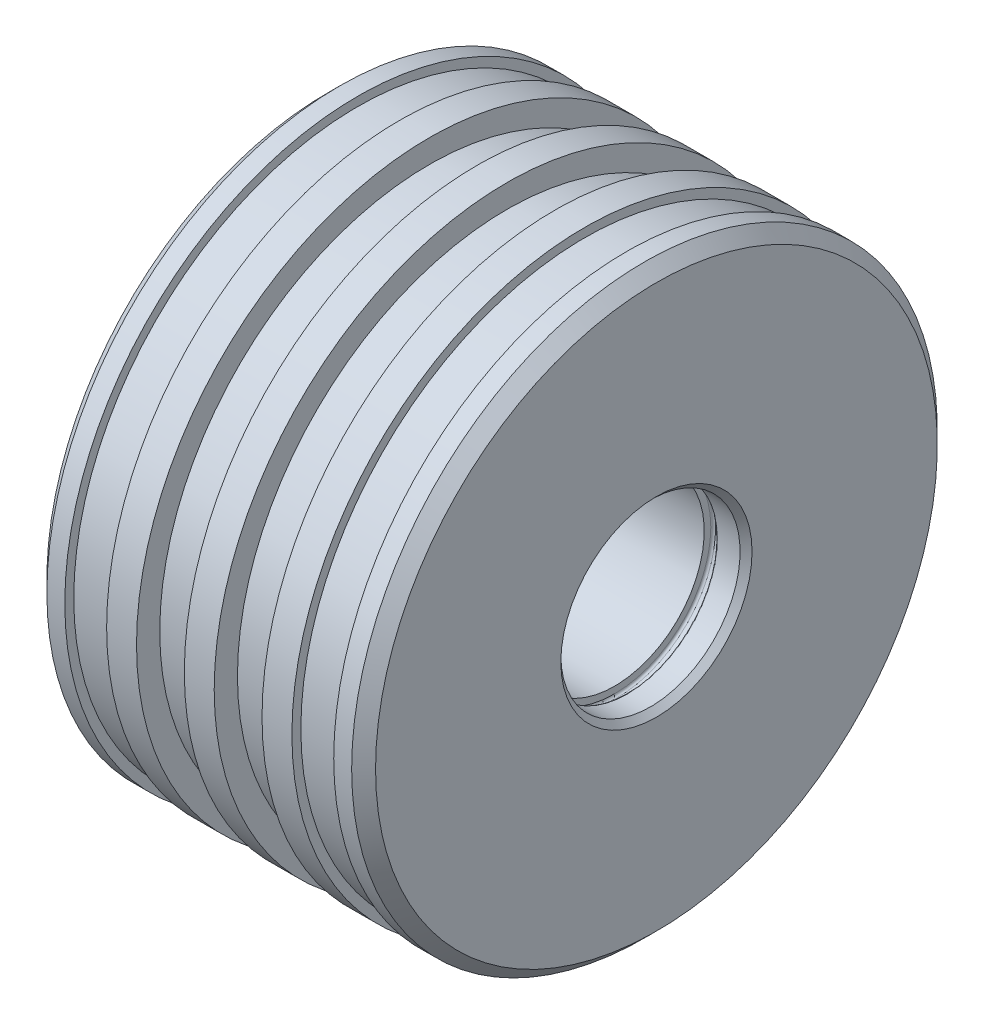
ISO-10303-21;
HEADER;
FILE_DESCRIPTION(('STEP AP214'),'2;1');
FILE_NAME('part.step','',(''),(''),'','','');
FILE_SCHEMA(('AUTOMOTIVE_DESIGN { 1 0 10303 214 1 1 1 1 }'));
ENDSEC;
DATA;
#1=APPLICATION_CONTEXT('core data for automotive mechanical design processes');
#2=APPLICATION_PROTOCOL_DEFINITION('international standard','automotive_design',2000,#1);
#3=PRODUCT_CONTEXT('',#1,'mechanical');
#4=PRODUCT('Part','Part','',(#3));
#5=PRODUCT_RELATED_PRODUCT_CATEGORY('part','',(#4));
#6=PRODUCT_DEFINITION_FORMATION('','',#4);
#7=PRODUCT_DEFINITION_CONTEXT('part definition',#1,'design');
#8=PRODUCT_DEFINITION('design','',#6,#7);
#9=PRODUCT_DEFINITION_SHAPE('','',#8);
#10=(LENGTH_UNIT() NAMED_UNIT(*) SI_UNIT(.MILLI.,.METRE.));
#11=(NAMED_UNIT(*) PLANE_ANGLE_UNIT() SI_UNIT($,.RADIAN.));
#12=(NAMED_UNIT(*) SI_UNIT($,.STERADIAN.) SOLID_ANGLE_UNIT());
#13=UNCERTAINTY_MEASURE_WITH_UNIT(LENGTH_MEASURE(1.E-05),#10,'distance_accuracy_value','');
#14=(GEOMETRIC_REPRESENTATION_CONTEXT(3) GLOBAL_UNCERTAINTY_ASSIGNED_CONTEXT((#13)) GLOBAL_UNIT_ASSIGNED_CONTEXT((#10,
#11,#12)) REPRESENTATION_CONTEXT('',''));
#15=CARTESIAN_POINT('',(0.,0.,0.));
#16=DIRECTION('',(0.,0.,1.));
#17=DIRECTION('',(1.,0.,0.));
#18=AXIS2_PLACEMENT_3D('',#15,#16,#17);
#19=CARTESIAN_POINT('',(-27.5,-15.,0.));
#20=DIRECTION('',(-1.,0.,0.));
#21=DIRECTION('',(0.,0.,1.));
#22=AXIS2_PLACEMENT_3D('',#19,#20,#21);
#23=CYLINDRICAL_SURFACE('',#22,49.);
#24=CARTESIAN_POINT('',(-25.5,-15.,0.));
#25=DIRECTION('',(1.,0.,0.));
#26=DIRECTION('',(0.,0.,-1.));
#27=AXIS2_PLACEMENT_3D('',#24,#25,#26);
#28=CIRCLE('',#27,49.);
#29=CARTESIAN_POINT('',(-25.5,-15.,-49.));
#30=VERTEX_POINT('',#29);
#31=EDGE_CURVE('E103',#30,#30,#28,.T.);
#32=ORIENTED_EDGE('',*,*,#31,.T.);
#33=EDGE_LOOP('',(#32));
#34=FACE_BOUND('',#33,.T.);
#35=CARTESIAN_POINT('',(-22.5,-15.,0.));
#36=DIRECTION('',(-1.,0.,0.));
#37=DIRECTION('',(0.,0.,1.));
#38=AXIS2_PLACEMENT_3D('',#35,#36,#37);
#39=CIRCLE('',#38,49.);
#40=CARTESIAN_POINT('',(-22.5,-15.,49.));
#41=VERTEX_POINT('',#40);
#42=EDGE_CURVE('E109',#41,#41,#39,.T.);
#43=ORIENTED_EDGE('',*,*,#42,.T.);
#44=EDGE_LOOP('',(#43));
#45=FACE_BOUND('',#44,.T.);
#46=ADVANCED_FACE('F41',(#34,#45),#23,.T.);
#47=CARTESIAN_POINT('',(-22.5,34.,0.));
#48=DIRECTION('',(-1.,0.,0.));
#49=DIRECTION('',(0.,0.,1.));
#50=AXIS2_PLACEMENT_3D('',#47,#48,#49);
#51=PLANE('',#50);
#52=ORIENTED_EDGE('',*,*,#42,.F.);
#53=EDGE_LOOP('',(#52));
#54=FACE_BOUND('',#53,.T.);
#55=CARTESIAN_POINT('',(-22.5,-15.,0.));
#56=DIRECTION('',(-1.,0.,0.));
#57=DIRECTION('',(0.,0.,1.));
#58=AXIS2_PLACEMENT_3D('',#55,#56,#57);
#59=CIRCLE('',#58,47.5);
#60=CARTESIAN_POINT('',(-22.5,-15.,47.5));
#61=VERTEX_POINT('',#60);
#62=EDGE_CURVE('E112',#61,#61,#59,.T.);
#63=ORIENTED_EDGE('',*,*,#62,.T.);
#64=EDGE_LOOP('',(#63));
#65=FACE_BOUND('',#64,.T.);
#66=ADVANCED_FACE('F195',(#54,#65),#51,.F.);
#67=CARTESIAN_POINT('',(-27.5,-15.,0.));
#68=DIRECTION('',(-1.,0.,0.));
#69=DIRECTION('',(0.,0.,1.));
#70=AXIS2_PLACEMENT_3D('',#67,#68,#69);
#71=CYLINDRICAL_SURFACE('',#70,47.5);
#72=ORIENTED_EDGE('',*,*,#62,.F.);
#73=EDGE_LOOP('',(#72));
#74=FACE_BOUND('',#73,.T.);
#75=CARTESIAN_POINT('',(-15.5,-15.,0.));
#76=DIRECTION('',(-1.,0.,0.));
#77=DIRECTION('',(0.,0.,1.));
#78=AXIS2_PLACEMENT_3D('',#75,#76,#77);
#79=CIRCLE('',#78,47.5);
#80=CARTESIAN_POINT('',(-15.5,-15.,47.5));
#81=VERTEX_POINT('',#80);
#82=EDGE_CURVE('E115',#81,#81,#79,.T.);
#83=ORIENTED_EDGE('',*,*,#82,.T.);
#84=EDGE_LOOP('',(#83));
#85=FACE_BOUND('',#84,.T.);
#86=ADVANCED_FACE('F203',(#74,#85),#71,.T.);
#87=CARTESIAN_POINT('',(-15.5,32.5,0.));
#88=DIRECTION('',(1.,0.,0.));
#89=DIRECTION('',(0.,0.,-1.));
#90=AXIS2_PLACEMENT_3D('',#87,#88,#89);
#91=PLANE('',#90);
#92=ORIENTED_EDGE('',*,*,#82,.F.);
#93=EDGE_LOOP('',(#92));
#94=FACE_BOUND('',#93,.T.);
#95=CARTESIAN_POINT('',(-15.5,-15.,0.));
#96=DIRECTION('',(-1.,0.,0.));
#97=DIRECTION('',(0.,0.,1.));
#98=AXIS2_PLACEMENT_3D('',#95,#96,#97);
#99=CIRCLE('',#98,49.);
#100=CARTESIAN_POINT('',(-15.5,-15.,49.));
#101=VERTEX_POINT('',#100);
#102=EDGE_CURVE('E118',#101,#101,#99,.T.);
#103=ORIENTED_EDGE('',*,*,#102,.T.);
#104=EDGE_LOOP('',(#103));
#105=FACE_BOUND('',#104,.T.);
#106=ADVANCED_FACE('F342',(#94,#105),#91,.F.);
#107=CARTESIAN_POINT('',(-27.5,-15.,0.));
#108=DIRECTION('',(-1.,0.,0.));
#109=DIRECTION('',(0.,0.,1.));
#110=AXIS2_PLACEMENT_3D('',#107,#108,#109);
#111=CYLINDRICAL_SURFACE('',#110,49.);
#112=ORIENTED_EDGE('',*,*,#102,.F.);
#113=EDGE_LOOP('',(#112));
#114=FACE_BOUND('',#113,.T.);
#115=CARTESIAN_POINT('',(-10.5,-15.,0.));
#116=DIRECTION('',(-1.,0.,0.));
#117=DIRECTION('',(0.,0.,1.));
#118=AXIS2_PLACEMENT_3D('',#115,#116,#117);
#119=CIRCLE('',#118,49.);
#120=CARTESIAN_POINT('',(-10.5,-15.,49.));
#121=VERTEX_POINT('',#120);
#122=EDGE_CURVE('E121',#121,#121,#119,.T.);
#123=ORIENTED_EDGE('',*,*,#122,.T.);
#124=EDGE_LOOP('',(#123));
#125=FACE_BOUND('',#124,.T.);
#126=ADVANCED_FACE('F338',(#114,#125),#111,.T.);
#127=CARTESIAN_POINT('',(-10.5,34.,0.));
#128=DIRECTION('',(-1.,0.,0.));
#129=DIRECTION('',(0.,0.,1.));
#130=AXIS2_PLACEMENT_3D('',#127,#128,#129);
#131=PLANE('',#130);
#132=ORIENTED_EDGE('',*,*,#122,.F.);
#133=EDGE_LOOP('',(#132));
#134=FACE_BOUND('',#133,.T.);
#135=CARTESIAN_POINT('',(-10.5,-15.,0.));
#136=DIRECTION('',(-1.,0.,0.));
#137=DIRECTION('',(0.,0.,1.));
#138=AXIS2_PLACEMENT_3D('',#135,#136,#137);
#139=CIRCLE('',#138,45.11);
#140=CARTESIAN_POINT('',(-10.5,-15.,45.11));
#141=VERTEX_POINT('',#140);
#142=EDGE_CURVE('E124',#141,#141,#139,.T.);
#143=ORIENTED_EDGE('',*,*,#142,.T.);
#144=EDGE_LOOP('',(#143));
#145=FACE_BOUND('',#144,.T.);
#146=ADVANCED_FACE('F334',(#134,#145),#131,.F.);
#147=CARTESIAN_POINT('',(-27.5,-15.,0.));
#148=DIRECTION('',(-1.,0.,0.));
#149=DIRECTION('',(0.,0.,1.));
#150=AXIS2_PLACEMENT_3D('',#147,#148,#149);
#151=CYLINDRICAL_SURFACE('',#150,45.11);
#152=ORIENTED_EDGE('',*,*,#142,.F.);
#153=EDGE_LOOP('',(#152));
#154=FACE_BOUND('',#153,.T.);
#155=CARTESIAN_POINT('',(-2.5,-15.,0.));
#156=DIRECTION('',(-1.,0.,0.));
#157=DIRECTION('',(0.,0.,1.));
#158=AXIS2_PLACEMENT_3D('',#155,#156,#157);
#159=CIRCLE('',#158,45.11);
#160=CARTESIAN_POINT('',(-2.5,-15.,45.11));
#161=VERTEX_POINT('',#160);
#162=EDGE_CURVE('E127',#161,#161,#159,.T.);
#163=ORIENTED_EDGE('',*,*,#162,.T.);
#164=EDGE_LOOP('',(#163));
#165=FACE_BOUND('',#164,.T.);
#166=ADVANCED_FACE('F330',(#154,#165),#151,.T.);
#167=CARTESIAN_POINT('',(-2.5,30.11,0.));
#168=DIRECTION('',(1.,0.,0.));
#169=DIRECTION('',(0.,0.,-1.));
#170=AXIS2_PLACEMENT_3D('',#167,#168,#169);
#171=PLANE('',#170);
#172=ORIENTED_EDGE('',*,*,#162,.F.);
#173=EDGE_LOOP('',(#172));
#174=FACE_BOUND('',#173,.T.);
#175=CARTESIAN_POINT('',(-2.5,-15.,0.));
#176=DIRECTION('',(-1.,0.,0.));
#177=DIRECTION('',(0.,0.,1.));
#178=AXIS2_PLACEMENT_3D('',#175,#176,#177);
#179=CIRCLE('',#178,49.);
#180=CARTESIAN_POINT('',(-2.5,-15.,49.));
#181=VERTEX_POINT('',#180);
#182=EDGE_CURVE('E130',#181,#181,#179,.T.);
#183=ORIENTED_EDGE('',*,*,#182,.T.);
#184=EDGE_LOOP('',(#183));
#185=FACE_BOUND('',#184,.T.);
#186=ADVANCED_FACE('F326',(#174,#185),#171,.F.);
#187=CARTESIAN_POINT('',(-27.5,-15.,0.));
#188=DIRECTION('',(-1.,0.,0.));
#189=DIRECTION('',(0.,0.,1.));
#190=AXIS2_PLACEMENT_3D('',#187,#188,#189);
#191=CYLINDRICAL_SURFACE('',#190,49.);
#192=ORIENTED_EDGE('',*,*,#182,.F.);
#193=EDGE_LOOP('',(#192));
#194=FACE_BOUND('',#193,.T.);
#195=CARTESIAN_POINT('',(2.5,-15.,0.));
#196=DIRECTION('',(-1.,0.,0.));
#197=DIRECTION('',(0.,0.,1.));
#198=AXIS2_PLACEMENT_3D('',#195,#196,#197);
#199=CIRCLE('',#198,49.);
#200=CARTESIAN_POINT('',(2.5,-15.,49.));
#201=VERTEX_POINT('',#200);
#202=EDGE_CURVE('E133',#201,#201,#199,.T.);
#203=ORIENTED_EDGE('',*,*,#202,.T.);
#204=EDGE_LOOP('',(#203));
#205=FACE_BOUND('',#204,.T.);
#206=ADVANCED_FACE('F322',(#194,#205),#191,.T.);
#207=CARTESIAN_POINT('',(2.5,34.,0.));
#208=DIRECTION('',(-1.,0.,0.));
#209=DIRECTION('',(0.,0.,1.));
#210=AXIS2_PLACEMENT_3D('',#207,#208,#209);
#211=PLANE('',#210);
#212=ORIENTED_EDGE('',*,*,#202,.F.);
#213=EDGE_LOOP('',(#212));
#214=FACE_BOUND('',#213,.T.);
#215=CARTESIAN_POINT('',(2.5,-15.,0.));
#216=DIRECTION('',(-1.,0.,0.));
#217=DIRECTION('',(0.,0.,1.));
#218=AXIS2_PLACEMENT_3D('',#215,#216,#217);
#219=CIRCLE('',#218,45.11);
#220=CARTESIAN_POINT('',(2.5,-15.,45.11));
#221=VERTEX_POINT('',#220);
#222=EDGE_CURVE('E136',#221,#221,#219,.T.);
#223=ORIENTED_EDGE('',*,*,#222,.T.);
#224=EDGE_LOOP('',(#223));
#225=FACE_BOUND('',#224,.T.);
#226=ADVANCED_FACE('F318',(#214,#225),#211,.F.);
#227=CARTESIAN_POINT('',(-27.5,-15.,0.));
#228=DIRECTION('',(-1.,0.,0.));
#229=DIRECTION('',(0.,0.,1.));
#230=AXIS2_PLACEMENT_3D('',#227,#228,#229);
#231=CYLINDRICAL_SURFACE('',#230,45.11);
#232=ORIENTED_EDGE('',*,*,#222,.F.);
#233=EDGE_LOOP('',(#232));
#234=FACE_BOUND('',#233,.T.);
#235=CARTESIAN_POINT('',(10.5,-15.,0.));
#236=DIRECTION('',(-1.,0.,0.));
#237=DIRECTION('',(0.,0.,1.));
#238=AXIS2_PLACEMENT_3D('',#235,#236,#237);
#239=CIRCLE('',#238,45.11);
#240=CARTESIAN_POINT('',(10.5,-15.,45.11));
#241=VERTEX_POINT('',#240);
#242=EDGE_CURVE('E139',#241,#241,#239,.T.);
#243=ORIENTED_EDGE('',*,*,#242,.T.);
#244=EDGE_LOOP('',(#243));
#245=FACE_BOUND('',#244,.T.);
#246=ADVANCED_FACE('F314',(#234,#245),#231,.T.);
#247=CARTESIAN_POINT('',(10.5,34.,0.));
#248=DIRECTION('',(1.,0.,0.));
#249=DIRECTION('',(0.,0.,-1.));
#250=AXIS2_PLACEMENT_3D('',#247,#248,#249);
#251=PLANE('',#250);
#252=ORIENTED_EDGE('',*,*,#242,.F.);
#253=EDGE_LOOP('',(#252));
#254=FACE_BOUND('',#253,.T.);
#255=CARTESIAN_POINT('',(10.5,-15.,0.));
#256=DIRECTION('',(-1.,0.,0.));
#257=DIRECTION('',(0.,0.,1.));
#258=AXIS2_PLACEMENT_3D('',#255,#256,#257);
#259=CIRCLE('',#258,49.);
#260=CARTESIAN_POINT('',(10.5,-15.,49.));
#261=VERTEX_POINT('',#260);
#262=EDGE_CURVE('E142',#261,#261,#259,.T.);
#263=ORIENTED_EDGE('',*,*,#262,.T.);
#264=EDGE_LOOP('',(#263));
#265=FACE_BOUND('',#264,.T.);
#266=ADVANCED_FACE('F310',(#254,#265),#251,.F.);
#267=CARTESIAN_POINT('',(-27.5,-15.,0.));
#268=DIRECTION('',(-1.,0.,0.));
#269=DIRECTION('',(0.,0.,1.));
#270=AXIS2_PLACEMENT_3D('',#267,#268,#269);
#271=CYLINDRICAL_SURFACE('',#270,49.);
#272=ORIENTED_EDGE('',*,*,#262,.F.);
#273=EDGE_LOOP('',(#272));
#274=FACE_BOUND('',#273,.T.);
#275=CARTESIAN_POINT('',(15.5,-15.,0.));
#276=DIRECTION('',(-1.,0.,0.));
#277=DIRECTION('',(0.,0.,1.));
#278=AXIS2_PLACEMENT_3D('',#275,#276,#277);
#279=CIRCLE('',#278,49.);
#280=CARTESIAN_POINT('',(15.5,-15.,49.));
#281=VERTEX_POINT('',#280);
#282=EDGE_CURVE('E145',#281,#281,#279,.T.);
#283=ORIENTED_EDGE('',*,*,#282,.T.);
#284=EDGE_LOOP('',(#283));
#285=FACE_BOUND('',#284,.T.);
#286=ADVANCED_FACE('F306',(#274,#285),#271,.T.);
#287=CARTESIAN_POINT('',(15.5,32.5,0.));
#288=DIRECTION('',(-1.,0.,0.));
#289=DIRECTION('',(0.,0.,1.));
#290=AXIS2_PLACEMENT_3D('',#287,#288,#289);
#291=PLANE('',#290);
#292=ORIENTED_EDGE('',*,*,#282,.F.);
#293=EDGE_LOOP('',(#292));
#294=FACE_BOUND('',#293,.T.);
#295=CARTESIAN_POINT('',(15.5,-15.,0.));
#296=DIRECTION('',(-1.,0.,0.));
#297=DIRECTION('',(0.,0.,1.));
#298=AXIS2_PLACEMENT_3D('',#295,#296,#297);
#299=CIRCLE('',#298,47.5);
#300=CARTESIAN_POINT('',(15.5,-15.,47.5));
#301=VERTEX_POINT('',#300);
#302=EDGE_CURVE('E148',#301,#301,#299,.T.);
#303=ORIENTED_EDGE('',*,*,#302,.T.);
#304=EDGE_LOOP('',(#303));
#305=FACE_BOUND('',#304,.T.);
#306=ADVANCED_FACE('F302',(#294,#305),#291,.F.);
#307=CARTESIAN_POINT('',(-27.5,-15.,0.));
#308=DIRECTION('',(-1.,0.,0.));
#309=DIRECTION('',(0.,0.,1.));
#310=AXIS2_PLACEMENT_3D('',#307,#308,#309);
#311=CYLINDRICAL_SURFACE('',#310,47.5);
#312=ORIENTED_EDGE('',*,*,#302,.F.);
#313=EDGE_LOOP('',(#312));
#314=FACE_BOUND('',#313,.T.);
#315=CARTESIAN_POINT('',(22.5,-15.,0.));
#316=DIRECTION('',(-1.,0.,0.));
#317=DIRECTION('',(0.,0.,1.));
#318=AXIS2_PLACEMENT_3D('',#315,#316,#317);
#319=CIRCLE('',#318,47.5);
#320=CARTESIAN_POINT('',(22.5,-15.,47.5));
#321=VERTEX_POINT('',#320);
#322=EDGE_CURVE('E151',#321,#321,#319,.T.);
#323=ORIENTED_EDGE('',*,*,#322,.T.);
#324=EDGE_LOOP('',(#323));
#325=FACE_BOUND('',#324,.T.);
#326=ADVANCED_FACE('F298',(#314,#325),#311,.T.);
#327=CARTESIAN_POINT('',(22.5,34.,0.));
#328=DIRECTION('',(1.,0.,0.));
#329=DIRECTION('',(0.,0.,-1.));
#330=AXIS2_PLACEMENT_3D('',#327,#328,#329);
#331=PLANE('',#330);
#332=ORIENTED_EDGE('',*,*,#322,.F.);
#333=EDGE_LOOP('',(#332));
#334=FACE_BOUND('',#333,.T.);
#335=CARTESIAN_POINT('',(22.5,-15.,0.));
#336=DIRECTION('',(-1.,0.,0.));
#337=DIRECTION('',(0.,0.,1.));
#338=AXIS2_PLACEMENT_3D('',#335,#336,#337);
#339=CIRCLE('',#338,49.);
#340=CARTESIAN_POINT('',(22.5,-15.,49.));
#341=VERTEX_POINT('',#340);
#342=EDGE_CURVE('E154',#341,#341,#339,.T.);
#343=ORIENTED_EDGE('',*,*,#342,.T.);
#344=EDGE_LOOP('',(#343));
#345=FACE_BOUND('',#344,.T.);
#346=ADVANCED_FACE('F295',(#334,#345),#331,.F.);
#347=CARTESIAN_POINT('',(-27.5,-15.,0.));
#348=DIRECTION('',(-1.,0.,0.));
#349=DIRECTION('',(0.,0.,1.));
#350=AXIS2_PLACEMENT_3D('',#347,#348,#349);
#351=CYLINDRICAL_SURFACE('',#350,49.);
#352=CARTESIAN_POINT('',(25.5,-15.,0.));
#353=DIRECTION('',(-1.,0.,0.));
#354=DIRECTION('',(0.,0.,1.));
#355=AXIS2_PLACEMENT_3D('',#352,#353,#354);
#356=CIRCLE('',#355,49.);
#357=CARTESIAN_POINT('',(25.5,-15.,49.));
#358=VERTEX_POINT('',#357);
#359=EDGE_CURVE('E100',#358,#358,#356,.T.);
#360=ORIENTED_EDGE('',*,*,#359,.T.);
#361=EDGE_LOOP('',(#360));
#362=FACE_BOUND('',#361,.T.);
#363=ORIENTED_EDGE('',*,*,#342,.F.);
#364=EDGE_LOOP('',(#363));
#365=FACE_BOUND('',#364,.T.);
#366=ADVANCED_FACE('F292',(#362,#365),#351,.T.);
#367=CARTESIAN_POINT('',(27.5,30.11,0.));
#368=DIRECTION('',(-1.,0.,0.));
#369=DIRECTION('',(0.,0.,1.));
#370=AXIS2_PLACEMENT_3D('',#367,#368,#369);
#371=PLANE('',#370);
#372=CARTESIAN_POINT('',(27.5,-15.,0.));
#373=DIRECTION('',(-1.,0.,0.));
#374=DIRECTION('',(0.,0.,1.));
#375=AXIS2_PLACEMENT_3D('',#372,#373,#374);
#376=CIRCLE('',#375,16.);
#377=CARTESIAN_POINT('',(27.5,-15.,16.));
#378=VERTEX_POINT('',#377);
#379=EDGE_CURVE('E94',#378,#378,#376,.T.);
#380=ORIENTED_EDGE('',*,*,#379,.T.);
#381=EDGE_LOOP('',(#380));
#382=FACE_BOUND('',#381,.T.);
#383=CARTESIAN_POINT('',(27.5,-15.,0.));
#384=DIRECTION('',(-1.,0.,0.));
#385=DIRECTION('',(0.,0.,1.));
#386=AXIS2_PLACEMENT_3D('',#383,#384,#385);
#387=CIRCLE('',#386,47.);
#388=CARTESIAN_POINT('',(27.5,-15.,47.));
#389=VERTEX_POINT('',#388);
#390=EDGE_CURVE('E97',#389,#389,#387,.F.);
#391=ORIENTED_EDGE('',*,*,#390,.T.);
#392=EDGE_LOOP('',(#391));
#393=FACE_BOUND('',#392,.T.);
#394=ADVANCED_FACE('F289',(#382,#393),#371,.F.);
#395=CARTESIAN_POINT('',(-27.5,-15.,0.));
#396=DIRECTION('',(-1.,0.,0.));
#397=DIRECTION('',(0.,0.,1.));
#398=AXIS2_PLACEMENT_3D('',#395,#396,#397);
#399=CYLINDRICAL_SURFACE('',#398,15.);
#400=CARTESIAN_POINT('',(22.7,-15.,0.));
#401=DIRECTION('',(1.,0.,0.));
#402=DIRECTION('',(0.,0.,-1.));
#403=AXIS2_PLACEMENT_3D('',#400,#401,#402);
#404=CIRCLE('',#403,15.);
#405=CARTESIAN_POINT('',(22.7,-15.,-15.));
#406=VERTEX_POINT('',#405);
#407=EDGE_CURVE('E64',#406,#406,#404,.F.);
#408=ORIENTED_EDGE('',*,*,#407,.T.);
#409=EDGE_LOOP('',(#408));
#410=FACE_BOUND('',#409,.T.);
#411=CARTESIAN_POINT('',(26.5,-15.,0.));
#412=DIRECTION('',(-1.,0.,0.));
#413=DIRECTION('',(0.,0.,1.));
#414=AXIS2_PLACEMENT_3D('',#411,#412,#413);
#415=CIRCLE('',#414,15.);
#416=CARTESIAN_POINT('',(26.5,-15.,15.));
#417=VERTEX_POINT('',#416);
#418=EDGE_CURVE('E91',#417,#417,#415,.F.);
#419=ORIENTED_EDGE('',*,*,#418,.T.);
#420=EDGE_LOOP('',(#419));
#421=FACE_BOUND('',#420,.T.);
#422=ADVANCED_FACE('F285',(#410,#421),#399,.F.);
#423=CARTESIAN_POINT('',(22.5,0.,0.));
#424=DIRECTION('',(1.,0.,0.));
#425=DIRECTION('',(0.,0.,-1.));
#426=AXIS2_PLACEMENT_3D('',#423,#424,#425);
#427=PLANE('',#426);
#428=CARTESIAN_POINT('',(22.5,-15.,0.));
#429=DIRECTION('',(1.,0.,0.));
#430=DIRECTION('',(0.,0.,-1.));
#431=AXIS2_PLACEMENT_3D('',#428,#429,#430);
#432=CIRCLE('',#431,15.2);
#433=CARTESIAN_POINT('',(22.5,-15.,-15.2));
#434=VERTEX_POINT('',#433);
#435=EDGE_CURVE('E61',#434,#434,#432,.T.);
#436=ORIENTED_EDGE('',*,*,#435,.T.);
#437=EDGE_LOOP('',(#436));
#438=FACE_BOUND('',#437,.T.);
#439=CARTESIAN_POINT('',(22.5,-15.,0.));
#440=DIRECTION('',(-1.,0.,0.));
#441=DIRECTION('',(0.,0.,1.));
#442=AXIS2_PLACEMENT_3D('',#439,#440,#441);
#443=CIRCLE('',#442,16.5);
#444=CARTESIAN_POINT('',(22.5,-15.,16.5));
#445=VERTEX_POINT('',#444);
#446=EDGE_CURVE('E157',#445,#445,#443,.T.);
#447=ORIENTED_EDGE('',*,*,#446,.T.);
#448=EDGE_LOOP('',(#447));
#449=FACE_BOUND('',#448,.T.);
#450=ADVANCED_FACE('F278',(#438,#449),#427,.F.);
#451=CARTESIAN_POINT('',(-27.5,-15.,0.));
#452=DIRECTION('',(-1.,0.,0.));
#453=DIRECTION('',(0.,0.,1.));
#454=AXIS2_PLACEMENT_3D('',#451,#452,#453);
#455=CYLINDRICAL_SURFACE('',#454,16.5);
#456=CARTESIAN_POINT('',(20.9,-15.,0.));
#457=DIRECTION('',(-1.,0.,0.));
#458=DIRECTION('',(0.,0.,1.));
#459=AXIS2_PLACEMENT_3D('',#456,#457,#458);
#460=CIRCLE('',#459,16.5);
#461=CARTESIAN_POINT('',(20.9,-15.,16.5));
#462=VERTEX_POINT('',#461);
#463=EDGE_CURVE('E82',#462,#462,#460,.T.);
#464=ORIENTED_EDGE('',*,*,#463,.T.);
#465=EDGE_LOOP('',(#464));
#466=FACE_BOUND('',#465,.T.);
#467=ORIENTED_EDGE('',*,*,#446,.F.);
#468=EDGE_LOOP('',(#467));
#469=FACE_BOUND('',#468,.T.);
#470=ADVANCED_FACE('F271',(#466,#469),#455,.F.);
#471=CARTESIAN_POINT('',(20.5,1.5,0.));
#472=DIRECTION('',(-1.,0.,0.));
#473=DIRECTION('',(0.,0.,1.));
#474=AXIS2_PLACEMENT_3D('',#471,#472,#473);
#475=PLANE('',#474);
#476=CARTESIAN_POINT('',(20.5,-15.,0.));
#477=DIRECTION('',(-1.,0.,0.));
#478=DIRECTION('',(0.,0.,1.));
#479=AXIS2_PLACEMENT_3D('',#476,#477,#478);
#480=CIRCLE('',#479,16.1);
#481=CARTESIAN_POINT('',(20.5,-15.,16.1));
#482=VERTEX_POINT('',#481);
#483=EDGE_CURVE('E79',#482,#482,#480,.F.);
#484=ORIENTED_EDGE('',*,*,#483,.T.);
#485=EDGE_LOOP('',(#484));
#486=FACE_BOUND('',#485,.T.);
#487=CARTESIAN_POINT('',(20.5,-15.,0.));
#488=DIRECTION('',(-1.,0.,0.));
#489=DIRECTION('',(0.,0.,1.));
#490=AXIS2_PLACEMENT_3D('',#487,#488,#489);
#491=CIRCLE('',#490,15.);
#492=CARTESIAN_POINT('',(20.5,-15.,15.));
#493=VERTEX_POINT('',#492);
#494=EDGE_CURVE('E160',#493,#493,#491,.T.);
#495=ORIENTED_EDGE('',*,*,#494,.T.);
#496=EDGE_LOOP('',(#495));
#497=FACE_BOUND('',#496,.T.);
#498=ADVANCED_FACE('F266',(#486,#497),#475,.F.);
#499=CARTESIAN_POINT('',(-27.5,-15.,0.));
#500=DIRECTION('',(-1.,0.,0.));
#501=DIRECTION('',(0.,0.,1.));
#502=AXIS2_PLACEMENT_3D('',#499,#500,#501);
#503=CYLINDRICAL_SURFACE('',#502,15.);
#504=CARTESIAN_POINT('',(1.2,-15.,0.));
#505=DIRECTION('',(1.,0.,0.));
#506=DIRECTION('',(0.,0.,-1.));
#507=AXIS2_PLACEMENT_3D('',#504,#505,#506);
#508=CIRCLE('',#507,15.);
#509=CARTESIAN_POINT('',(1.2,-15.,-15.));
#510=VERTEX_POINT('',#509);
#511=EDGE_CURVE('E56',#510,#510,#508,.F.);
#512=ORIENTED_EDGE('',*,*,#511,.T.);
#513=EDGE_LOOP('',(#512));
#514=FACE_BOUND('',#513,.T.);
#515=ORIENTED_EDGE('',*,*,#494,.F.);
#516=EDGE_LOOP('',(#515));
#517=FACE_BOUND('',#516,.T.);
#518=ADVANCED_FACE('F262',(#514,#517),#503,.F.);
#519=CARTESIAN_POINT('',(1.,1.5,0.));
#520=DIRECTION('',(1.,0.,0.));
#521=DIRECTION('',(0.,0.,-1.));
#522=AXIS2_PLACEMENT_3D('',#519,#520,#521);
#523=PLANE('',#522);
#524=CARTESIAN_POINT('',(1.,-15.,0.));
#525=DIRECTION('',(1.,0.,0.));
#526=DIRECTION('',(0.,0.,-1.));
#527=AXIS2_PLACEMENT_3D('',#524,#525,#526);
#528=CIRCLE('',#527,15.2);
#529=CARTESIAN_POINT('',(1.,-15.,-15.2));
#530=VERTEX_POINT('',#529);
#531=EDGE_CURVE('E52',#530,#530,#528,.T.);
#532=ORIENTED_EDGE('',*,*,#531,.T.);
#533=EDGE_LOOP('',(#532));
#534=FACE_BOUND('',#533,.T.);
#535=CARTESIAN_POINT('',(1.,-15.,0.));
#536=DIRECTION('',(-1.,0.,0.));
#537=DIRECTION('',(0.,0.,1.));
#538=AXIS2_PLACEMENT_3D('',#535,#536,#537);
#539=CIRCLE('',#538,16.5);
#540=CARTESIAN_POINT('',(1.,-15.,16.5));
#541=VERTEX_POINT('',#540);
#542=EDGE_CURVE('E163',#541,#541,#539,.T.);
#543=ORIENTED_EDGE('',*,*,#542,.T.);
#544=EDGE_LOOP('',(#543));
#545=FACE_BOUND('',#544,.T.);
#546=ADVANCED_FACE('F265',(#534,#545),#523,.F.);
#547=CARTESIAN_POINT('',(-27.5,-15.,0.));
#548=DIRECTION('',(-1.,0.,0.));
#549=DIRECTION('',(0.,0.,1.));
#550=AXIS2_PLACEMENT_3D('',#547,#548,#549);
#551=CYLINDRICAL_SURFACE('',#550,16.5);
#552=CARTESIAN_POINT('',(-0.6,-15.,0.));
#553=DIRECTION('',(-1.,0.,0.));
#554=DIRECTION('',(0.,0.,1.));
#555=AXIS2_PLACEMENT_3D('',#552,#553,#554);
#556=CIRCLE('',#555,16.5);
#557=CARTESIAN_POINT('',(-0.6,-15.,16.5));
#558=VERTEX_POINT('',#557);
#559=EDGE_CURVE('E76',#558,#558,#556,.T.);
#560=ORIENTED_EDGE('',*,*,#559,.T.);
#561=EDGE_LOOP('',(#560));
#562=FACE_BOUND('',#561,.T.);
#563=ORIENTED_EDGE('',*,*,#542,.F.);
#564=EDGE_LOOP('',(#563));
#565=FACE_BOUND('',#564,.T.);
#566=ADVANCED_FACE('F501',(#562,#565),#551,.F.);
#567=CARTESIAN_POINT('',(-0.999999999999999,1.5,0.));
#568=DIRECTION('',(-1.,0.,0.));
#569=DIRECTION('',(0.,0.,1.));
#570=AXIS2_PLACEMENT_3D('',#567,#568,#569);
#571=PLANE('',#570);
#572=CARTESIAN_POINT('',(-0.999999999999999,-15.,0.));
#573=DIRECTION('',(-1.,0.,0.));
#574=DIRECTION('',(0.,0.,1.));
#575=AXIS2_PLACEMENT_3D('',#572,#573,#574);
#576=CIRCLE('',#575,16.1);
#577=CARTESIAN_POINT('',(-0.999999999999999,-15.,16.1));
#578=VERTEX_POINT('',#577);
#579=EDGE_CURVE('E73',#578,#578,#576,.F.);
#580=ORIENTED_EDGE('',*,*,#579,.T.);
#581=EDGE_LOOP('',(#580));
#582=FACE_BOUND('',#581,.T.);
#583=CARTESIAN_POINT('',(-0.999999999999997,-15.,0.));
#584=DIRECTION('',(-1.,0.,0.));
#585=DIRECTION('',(0.,0.,1.));
#586=AXIS2_PLACEMENT_3D('',#583,#584,#585);
#587=CIRCLE('',#586,15.);
#588=CARTESIAN_POINT('',(-0.999999999999997,-15.,15.));
#589=VERTEX_POINT('',#588);
#590=EDGE_CURVE('E166',#589,#589,#587,.T.);
#591=ORIENTED_EDGE('',*,*,#590,.T.);
#592=EDGE_LOOP('',(#591));
#593=FACE_BOUND('',#592,.T.);
#594=ADVANCED_FACE('F510',(#582,#593),#571,.F.);
#595=CARTESIAN_POINT('',(-27.5,-15.,0.));
#596=DIRECTION('',(-1.,0.,0.));
#597=DIRECTION('',(0.,0.,1.));
#598=AXIS2_PLACEMENT_3D('',#595,#596,#597);
#599=CYLINDRICAL_SURFACE('',#598,15.);
#600=CARTESIAN_POINT('',(-20.3,-15.,0.));
#601=DIRECTION('',(1.,0.,0.));
#602=DIRECTION('',(0.,0.,-1.));
#603=AXIS2_PLACEMENT_3D('',#600,#601,#602);
#604=CIRCLE('',#603,15.);
#605=CARTESIAN_POINT('',(-20.3,-15.,-15.));
#606=VERTEX_POINT('',#605);
#607=EDGE_CURVE('E48',#606,#606,#604,.F.);
#608=ORIENTED_EDGE('',*,*,#607,.T.);
#609=EDGE_LOOP('',(#608));
#610=FACE_BOUND('',#609,.T.);
#611=ORIENTED_EDGE('',*,*,#590,.F.);
#612=EDGE_LOOP('',(#611));
#613=FACE_BOUND('',#612,.T.);
#614=ADVANCED_FACE('F520',(#610,#613),#599,.F.);
#615=CARTESIAN_POINT('',(-20.5,1.5,0.));
#616=DIRECTION('',(1.,0.,0.));
#617=DIRECTION('',(0.,0.,-1.));
#618=AXIS2_PLACEMENT_3D('',#615,#616,#617);
#619=PLANE('',#618);
#620=CARTESIAN_POINT('',(-20.5,-15.,0.));
#621=DIRECTION('',(1.,0.,0.));
#622=DIRECTION('',(0.,0.,-1.));
#623=AXIS2_PLACEMENT_3D('',#620,#621,#622);
#624=CIRCLE('',#623,15.2);
#625=CARTESIAN_POINT('',(-20.5,-15.,-15.2));
#626=VERTEX_POINT('',#625);
#627=EDGE_CURVE('E10',#626,#626,#624,.T.);
#628=ORIENTED_EDGE('',*,*,#627,.T.);
#629=EDGE_LOOP('',(#628));
#630=FACE_BOUND('',#629,.T.);
#631=CARTESIAN_POINT('',(-20.5,-15.,0.));
#632=DIRECTION('',(-1.,0.,0.));
#633=DIRECTION('',(0.,0.,1.));
#634=AXIS2_PLACEMENT_3D('',#631,#632,#633);
#635=CIRCLE('',#634,16.5);
#636=CARTESIAN_POINT('',(-20.5,-15.,16.5));
#637=VERTEX_POINT('',#636);
#638=EDGE_CURVE('E169',#637,#637,#635,.T.);
#639=ORIENTED_EDGE('',*,*,#638,.T.);
#640=EDGE_LOOP('',(#639));
#641=FACE_BOUND('',#640,.T.);
#642=ADVANCED_FACE('F530',(#630,#641),#619,.F.);
#643=CARTESIAN_POINT('',(-27.5,-15.,0.));
#644=DIRECTION('',(-1.,0.,0.));
#645=DIRECTION('',(0.,0.,1.));
#646=AXIS2_PLACEMENT_3D('',#643,#644,#645);
#647=CYLINDRICAL_SURFACE('',#646,16.5);
#648=CARTESIAN_POINT('',(-22.1,-15.,0.));
#649=DIRECTION('',(-1.,0.,0.));
#650=DIRECTION('',(0.,0.,1.));
#651=AXIS2_PLACEMENT_3D('',#648,#649,#650);
#652=CIRCLE('',#651,16.5);
#653=CARTESIAN_POINT('',(-22.1,-15.,16.5));
#654=VERTEX_POINT('',#653);
#655=EDGE_CURVE('E70',#654,#654,#652,.T.);
#656=ORIENTED_EDGE('',*,*,#655,.T.);
#657=EDGE_LOOP('',(#656));
#658=FACE_BOUND('',#657,.T.);
#659=ORIENTED_EDGE('',*,*,#638,.F.);
#660=EDGE_LOOP('',(#659));
#661=FACE_BOUND('',#660,.T.);
#662=ADVANCED_FACE('F191',(#658,#661),#647,.F.);
#663=CARTESIAN_POINT('',(-22.5,0.,0.));
#664=DIRECTION('',(-1.,0.,0.));
#665=DIRECTION('',(0.,0.,1.));
#666=AXIS2_PLACEMENT_3D('',#663,#664,#665);
#667=PLANE('',#666);
#668=CARTESIAN_POINT('',(-22.5,-15.,0.));
#669=DIRECTION('',(-1.,0.,0.));
#670=DIRECTION('',(0.,0.,1.));
#671=AXIS2_PLACEMENT_3D('',#668,#669,#670);
#672=CIRCLE('',#671,16.1);
#673=CARTESIAN_POINT('',(-22.5,-15.,16.1));
#674=VERTEX_POINT('',#673);
#675=EDGE_CURVE('E67',#674,#674,#672,.F.);
#676=ORIENTED_EDGE('',*,*,#675,.T.);
#677=EDGE_LOOP('',(#676));
#678=FACE_BOUND('',#677,.T.);
#679=CARTESIAN_POINT('',(-22.5,-15.,0.));
#680=DIRECTION('',(-1.,0.,0.));
#681=DIRECTION('',(0.,0.,1.));
#682=AXIS2_PLACEMENT_3D('',#679,#680,#681);
#683=CIRCLE('',#682,15.);
#684=CARTESIAN_POINT('',(-22.5,-15.,15.));
#685=VERTEX_POINT('',#684);
#686=EDGE_CURVE('E172',#685,#685,#683,.T.);
#687=ORIENTED_EDGE('',*,*,#686,.T.);
#688=EDGE_LOOP('',(#687));
#689=FACE_BOUND('',#688,.T.);
#690=ADVANCED_FACE('F176',(#678,#689),#667,.F.);
#691=CARTESIAN_POINT('',(-27.5,-15.,0.));
#692=DIRECTION('',(-1.,0.,0.));
#693=DIRECTION('',(0.,0.,1.));
#694=AXIS2_PLACEMENT_3D('',#691,#692,#693);
#695=CYLINDRICAL_SURFACE('',#694,15.);
#696=CARTESIAN_POINT('',(-26.5,-15.,0.));
#697=DIRECTION('',(1.,0.,0.));
#698=DIRECTION('',(0.,0.,-1.));
#699=AXIS2_PLACEMENT_3D('',#696,#697,#698);
#700=CIRCLE('',#699,15.);
#701=CARTESIAN_POINT('',(-26.5,-15.,-15.));
#702=VERTEX_POINT('',#701);
#703=EDGE_CURVE('E88',#702,#702,#700,.F.);
#704=ORIENTED_EDGE('',*,*,#703,.T.);
#705=EDGE_LOOP('',(#704));
#706=FACE_BOUND('',#705,.T.);
#707=ORIENTED_EDGE('',*,*,#686,.F.);
#708=EDGE_LOOP('',(#707));
#709=FACE_BOUND('',#708,.T.);
#710=ADVANCED_FACE('F178',(#706,#709),#695,.F.);
#711=CARTESIAN_POINT('',(-27.5,30.11,0.));
#712=DIRECTION('',(1.,0.,0.));
#713=DIRECTION('',(0.,0.,-1.));
#714=AXIS2_PLACEMENT_3D('',#711,#712,#713);
#715=PLANE('',#714);
#716=CARTESIAN_POINT('',(-27.5,-15.,0.));
#717=DIRECTION('',(1.,0.,0.));
#718=DIRECTION('',(0.,0.,-1.));
#719=AXIS2_PLACEMENT_3D('',#716,#717,#718);
#720=CIRCLE('',#719,16.);
#721=CARTESIAN_POINT('',(-27.5,-15.,-16.));
#722=VERTEX_POINT('',#721);
#723=EDGE_CURVE('E85',#722,#722,#720,.T.);
#724=ORIENTED_EDGE('',*,*,#723,.T.);
#725=EDGE_LOOP('',(#724));
#726=FACE_BOUND('',#725,.T.);
#727=CARTESIAN_POINT('',(-27.5,-15.,0.));
#728=DIRECTION('',(1.,0.,0.));
#729=DIRECTION('',(0.,0.,-1.));
#730=AXIS2_PLACEMENT_3D('',#727,#728,#729);
#731=CIRCLE('',#730,47.);
#732=CARTESIAN_POINT('',(-27.5,-15.,-47.));
#733=VERTEX_POINT('',#732);
#734=EDGE_CURVE('E106',#733,#733,#731,.F.);
#735=ORIENTED_EDGE('',*,*,#734,.T.);
#736=EDGE_LOOP('',(#735));
#737=FACE_BOUND('',#736,.T.);
#738=ADVANCED_FACE('F180',(#726,#737),#715,.F.);
#739=CARTESIAN_POINT('',(-27.5,-15.,0.));
#740=DIRECTION('',(1.,0.,0.));
#741=DIRECTION('',(0.,0.,-1.));
#742=AXIS2_PLACEMENT_3D('',#739,#740,#741);
#743=CONICAL_SURFACE('',#742,47.,0.785398163397452);
#744=ORIENTED_EDGE('',*,*,#31,.F.);
#745=EDGE_LOOP('',(#744));
#746=FACE_BOUND('',#745,.T.);
#747=ORIENTED_EDGE('',*,*,#734,.F.);
#748=EDGE_LOOP('',(#747));
#749=FACE_BOUND('',#748,.T.);
#750=ADVANCED_FACE('F187',(#746,#749),#743,.T.);
#751=CARTESIAN_POINT('',(25.5,-15.,0.));
#752=DIRECTION('',(-1.,0.,0.));
#753=DIRECTION('',(0.,0.,1.));
#754=AXIS2_PLACEMENT_3D('',#751,#752,#753);
#755=CONICAL_SURFACE('',#754,49.,0.78539816339745);
#756=ORIENTED_EDGE('',*,*,#390,.F.);
#757=EDGE_LOOP('',(#756));
#758=FACE_BOUND('',#757,.T.);
#759=ORIENTED_EDGE('',*,*,#359,.F.);
#760=EDGE_LOOP('',(#759));
#761=FACE_BOUND('',#760,.T.);
#762=ADVANCED_FACE('F215',(#758,#761),#755,.T.);
#763=CARTESIAN_POINT('',(27.5,-15.,0.));
#764=DIRECTION('',(1.,0.,0.));
#765=DIRECTION('',(0.,0.,-1.));
#766=AXIS2_PLACEMENT_3D('',#763,#764,#765);
#767=CONICAL_SURFACE('',#766,16.,0.785398163397448);
#768=ORIENTED_EDGE('',*,*,#418,.F.);
#769=EDGE_LOOP('',(#768));
#770=FACE_BOUND('',#769,.T.);
#771=ORIENTED_EDGE('',*,*,#379,.F.);
#772=EDGE_LOOP('',(#771));
#773=FACE_BOUND('',#772,.T.);
#774=ADVANCED_FACE('F222',(#770,#773),#767,.F.);
#775=CARTESIAN_POINT('',(-26.5,-15.,0.));
#776=DIRECTION('',(-1.,0.,0.));
#777=DIRECTION('',(0.,0.,1.));
#778=AXIS2_PLACEMENT_3D('',#775,#776,#777);
#779=CONICAL_SURFACE('',#778,15.,0.785398163397441);
#780=ORIENTED_EDGE('',*,*,#723,.F.);
#781=EDGE_LOOP('',(#780));
#782=FACE_BOUND('',#781,.T.);
#783=ORIENTED_EDGE('',*,*,#703,.F.);
#784=EDGE_LOOP('',(#783));
#785=FACE_BOUND('',#784,.T.);
#786=ADVANCED_FACE('F229',(#782,#785),#779,.F.);
#787=CARTESIAN_POINT('',(20.9,-15.,0.));
#788=DIRECTION('',(-1.,0.,0.));
#789=DIRECTION('',(0.,0.,1.));
#790=AXIS2_PLACEMENT_3D('',#787,#788,#789);
#791=TOROIDAL_SURFACE('',#790,16.1,0.4);
#792=ORIENTED_EDGE('',*,*,#483,.F.);
#793=EDGE_LOOP('',(#792));
#794=FACE_BOUND('',#793,.T.);
#795=ORIENTED_EDGE('',*,*,#463,.F.);
#796=EDGE_LOOP('',(#795));
#797=FACE_BOUND('',#796,.T.);
#798=ADVANCED_FACE('F235',(#794,#797),#791,.F.);
#799=CARTESIAN_POINT('',(-0.6,-15.,0.));
#800=DIRECTION('',(-1.,0.,0.));
#801=DIRECTION('',(0.,0.,1.));
#802=AXIS2_PLACEMENT_3D('',#799,#800,#801);
#803=TOROIDAL_SURFACE('',#802,16.1,0.4);
#804=ORIENTED_EDGE('',*,*,#579,.F.);
#805=EDGE_LOOP('',(#804));
#806=FACE_BOUND('',#805,.T.);
#807=ORIENTED_EDGE('',*,*,#559,.F.);
#808=EDGE_LOOP('',(#807));
#809=FACE_BOUND('',#808,.T.);
#810=ADVANCED_FACE('F239',(#806,#809),#803,.F.);
#811=CARTESIAN_POINT('',(-22.1,-15.,0.));
#812=DIRECTION('',(-1.,0.,0.));
#813=DIRECTION('',(0.,0.,1.));
#814=AXIS2_PLACEMENT_3D('',#811,#812,#813);
#815=TOROIDAL_SURFACE('',#814,16.1,0.4);
#816=ORIENTED_EDGE('',*,*,#675,.F.);
#817=EDGE_LOOP('',(#816));
#818=FACE_BOUND('',#817,.T.);
#819=ORIENTED_EDGE('',*,*,#655,.F.);
#820=EDGE_LOOP('',(#819));
#821=FACE_BOUND('',#820,.T.);
#822=ADVANCED_FACE('F243',(#818,#821),#815,.F.);
#823=CARTESIAN_POINT('',(22.7,-15.,0.));
#824=DIRECTION('',(1.,0.,0.));
#825=DIRECTION('',(0.,0.,-1.));
#826=AXIS2_PLACEMENT_3D('',#823,#824,#825);
#827=TOROIDAL_SURFACE('',#826,15.2,0.2);
#828=ORIENTED_EDGE('',*,*,#435,.F.);
#829=EDGE_LOOP('',(#828));
#830=FACE_BOUND('',#829,.T.);
#831=ORIENTED_EDGE('',*,*,#407,.F.);
#832=EDGE_LOOP('',(#831));
#833=FACE_BOUND('',#832,.T.);
#834=ADVANCED_FACE('F247',(#830,#833),#827,.T.);
#835=CARTESIAN_POINT('',(1.2,-15.,0.));
#836=DIRECTION('',(1.,0.,0.));
#837=DIRECTION('',(0.,0.,-1.));
#838=AXIS2_PLACEMENT_3D('',#835,#836,#837);
#839=TOROIDAL_SURFACE('',#838,15.2,0.2);
#840=ORIENTED_EDGE('',*,*,#531,.F.);
#841=EDGE_LOOP('',(#840));
#842=FACE_BOUND('',#841,.T.);
#843=ORIENTED_EDGE('',*,*,#511,.F.);
#844=EDGE_LOOP('',(#843));
#845=FACE_BOUND('',#844,.T.);
#846=ADVANCED_FACE('F250',(#842,#845),#839,.T.);
#847=CARTESIAN_POINT('',(-20.3,-15.,0.));
#848=DIRECTION('',(1.,0.,0.));
#849=DIRECTION('',(0.,0.,-1.));
#850=AXIS2_PLACEMENT_3D('',#847,#848,#849);
#851=TOROIDAL_SURFACE('',#850,15.2,0.2);
#852=ORIENTED_EDGE('',*,*,#627,.F.);
#853=EDGE_LOOP('',(#852));
#854=FACE_BOUND('',#853,.T.);
#855=ORIENTED_EDGE('',*,*,#607,.F.);
#856=EDGE_LOOP('',(#855));
#857=FACE_BOUND('',#856,.T.);
#858=ADVANCED_FACE('F43',(#854,#857),#851,.T.);
#859=CLOSED_SHELL('',(#46,#66,#86,#106,#126,#146,#166,#186,#206,#226,#246,#266,#286,#306,#326,
#346,#366,#394,#422,#450,#470,#498,#518,#546,#566,#594,#614,#642,#662,#690,#710,#738,#750,#762,
#774,#786,#798,#810,#822,#834,#846,#858));
#860=MANIFOLD_SOLID_BREP('B2',#859);
#861=ADVANCED_BREP_SHAPE_REPRESENTATION('',(#18,#860),#14);
#862=SHAPE_DEFINITION_REPRESENTATION(#9,#861);
ENDSEC;
END-ISO-10303-21;
